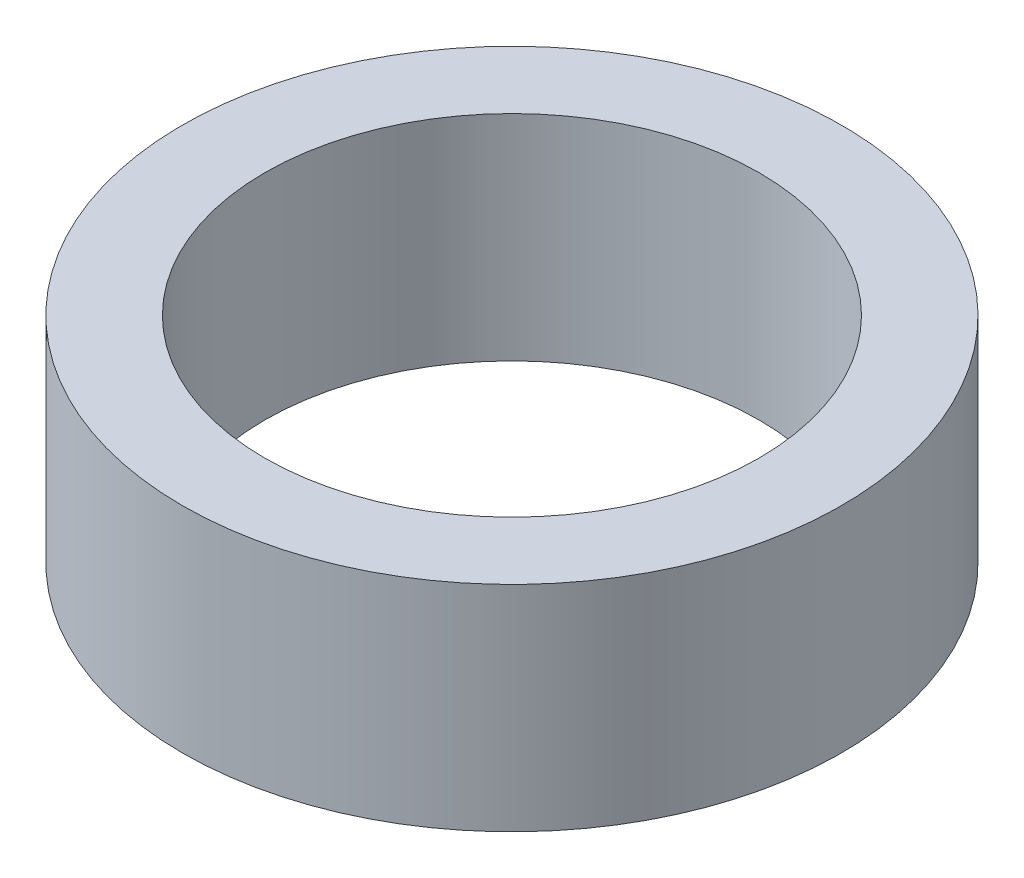
ISO-10303-21;
HEADER;
FILE_DESCRIPTION(('STEP AP214'),'2;1');
FILE_NAME('part.step','',(''),(''),'','','');
FILE_SCHEMA(('AUTOMOTIVE_DESIGN { 1 0 10303 214 1 1 1 1 }'));
ENDSEC;
DATA;
#1=APPLICATION_CONTEXT('core data for automotive mechanical design processes');
#2=APPLICATION_PROTOCOL_DEFINITION('international standard','automotive_design',2000,#1);
#3=PRODUCT_CONTEXT('',#1,'mechanical');
#4=PRODUCT('Part','Part','',(#3));
#5=PRODUCT_RELATED_PRODUCT_CATEGORY('part','',(#4));
#6=PRODUCT_DEFINITION_FORMATION('','',#4);
#7=PRODUCT_DEFINITION_CONTEXT('part definition',#1,'design');
#8=PRODUCT_DEFINITION('design','',#6,#7);
#9=PRODUCT_DEFINITION_SHAPE('','',#8);
#10=(LENGTH_UNIT() NAMED_UNIT(*) SI_UNIT(.MILLI.,.METRE.));
#11=(NAMED_UNIT(*) PLANE_ANGLE_UNIT() SI_UNIT($,.RADIAN.));
#12=(NAMED_UNIT(*) SI_UNIT($,.STERADIAN.) SOLID_ANGLE_UNIT());
#13=UNCERTAINTY_MEASURE_WITH_UNIT(LENGTH_MEASURE(1.E-05),#10,'distance_accuracy_value','');
#14=(GEOMETRIC_REPRESENTATION_CONTEXT(3) GLOBAL_UNCERTAINTY_ASSIGNED_CONTEXT((#13)) GLOBAL_UNIT_ASSIGNED_CONTEXT((#10,
#11,#12)) REPRESENTATION_CONTEXT('',''));
#15=CARTESIAN_POINT('',(0.,0.,0.));
#16=DIRECTION('',(0.,0.,1.));
#17=DIRECTION('',(1.,0.,0.));
#18=AXIS2_PLACEMENT_3D('',#15,#16,#17);
#19=CARTESIAN_POINT('',(0.,1.3,0.));
#20=DIRECTION('',(0.,1.,0.));
#21=DIRECTION('',(0.,0.,1.));
#22=AXIS2_PLACEMENT_3D('',#19,#20,#21);
#23=PLANE('',#22);
#24=CARTESIAN_POINT('',(0.,1.3,0.));
#25=DIRECTION('',(0.,1.,0.));
#26=DIRECTION('',(0.,0.,1.));
#27=AXIS2_PLACEMENT_3D('',#24,#25,#26);
#28=CIRCLE('',#27,2.);
#29=CARTESIAN_POINT('',(0.,1.3,2.));
#30=VERTEX_POINT('',#29);
#31=EDGE_CURVE('E10',#30,#30,#28,.T.);
#32=ORIENTED_EDGE('',*,*,#31,.T.);
#33=EDGE_LOOP('',(#32));
#34=FACE_BOUND('',#33,.T.);
#35=CARTESIAN_POINT('',(0.,1.3,0.));
#36=DIRECTION('',(0.,1.,0.));
#37=DIRECTION('',(0.,0.,1.));
#38=AXIS2_PLACEMENT_3D('',#35,#36,#37);
#39=CIRCLE('',#38,1.5);
#40=CARTESIAN_POINT('',(0.,1.3,1.5));
#41=VERTEX_POINT('',#40);
#42=EDGE_CURVE('E41',#41,#41,#39,.T.);
#43=ORIENTED_EDGE('',*,*,#42,.F.);
#44=EDGE_LOOP('',(#43));
#45=FACE_BOUND('',#44,.T.);
#46=ADVANCED_FACE('F30',(#34,#45),#23,.T.);
#47=CARTESIAN_POINT('',(0.,0.,0.));
#48=DIRECTION('',(0.,1.,0.));
#49=DIRECTION('',(0.,0.,1.));
#50=AXIS2_PLACEMENT_3D('',#47,#48,#49);
#51=PLANE('',#50);
#52=CARTESIAN_POINT('',(0.,0.,0.));
#53=DIRECTION('',(0.,1.,0.));
#54=DIRECTION('',(0.,0.,1.));
#55=AXIS2_PLACEMENT_3D('',#52,#53,#54);
#56=CIRCLE('',#55,2.);
#57=CARTESIAN_POINT('',(0.,0.,2.));
#58=VERTEX_POINT('',#57);
#59=EDGE_CURVE('E34',#58,#58,#56,.T.);
#60=ORIENTED_EDGE('',*,*,#59,.F.);
#61=EDGE_LOOP('',(#60));
#62=FACE_BOUND('',#61,.T.);
#63=CARTESIAN_POINT('',(0.,0.,0.));
#64=DIRECTION('',(0.,1.,0.));
#65=DIRECTION('',(0.,0.,1.));
#66=AXIS2_PLACEMENT_3D('',#63,#64,#65);
#67=CIRCLE('',#66,1.5);
#68=CARTESIAN_POINT('',(0.,0.,1.5));
#69=VERTEX_POINT('',#68);
#70=EDGE_CURVE('E43',#69,#69,#67,.T.);
#71=ORIENTED_EDGE('',*,*,#70,.T.);
#72=EDGE_LOOP('',(#71));
#73=FACE_BOUND('',#72,.T.);
#74=ADVANCED_FACE('F53',(#62,#73),#51,.F.);
#75=CARTESIAN_POINT('',(0.,1.3,0.));
#76=DIRECTION('',(0.,-1.,0.));
#77=DIRECTION('',(0.,0.,-1.));
#78=AXIS2_PLACEMENT_3D('',#75,#76,#77);
#79=CYLINDRICAL_SURFACE('',#78,2.);
#80=ORIENTED_EDGE('',*,*,#31,.F.);
#81=EDGE_LOOP('',(#80));
#82=FACE_BOUND('',#81,.T.);
#83=ORIENTED_EDGE('',*,*,#59,.T.);
#84=EDGE_LOOP('',(#83));
#85=FACE_BOUND('',#84,.T.);
#86=ADVANCED_FACE('F32',(#82,#85),#79,.T.);
#87=CARTESIAN_POINT('',(0.,1.3,0.));
#88=DIRECTION('',(0.,-1.,0.));
#89=DIRECTION('',(0.,0.,-1.));
#90=AXIS2_PLACEMENT_3D('',#87,#88,#89);
#91=CYLINDRICAL_SURFACE('',#90,1.5);
#92=ORIENTED_EDGE('',*,*,#42,.T.);
#93=EDGE_LOOP('',(#92));
#94=FACE_BOUND('',#93,.T.);
#95=ORIENTED_EDGE('',*,*,#70,.F.);
#96=EDGE_LOOP('',(#95));
#97=FACE_BOUND('',#96,.T.);
#98=ADVANCED_FACE('F49',(#94,#97),#91,.F.);
#99=CLOSED_SHELL('',(#46,#74,#86,#98));
#100=MANIFOLD_SOLID_BREP('B2',#99);
#101=ADVANCED_BREP_SHAPE_REPRESENTATION('',(#18,#100),#14);
#102=SHAPE_DEFINITION_REPRESENTATION(#9,#101);
ENDSEC;
END-ISO-10303-21;
